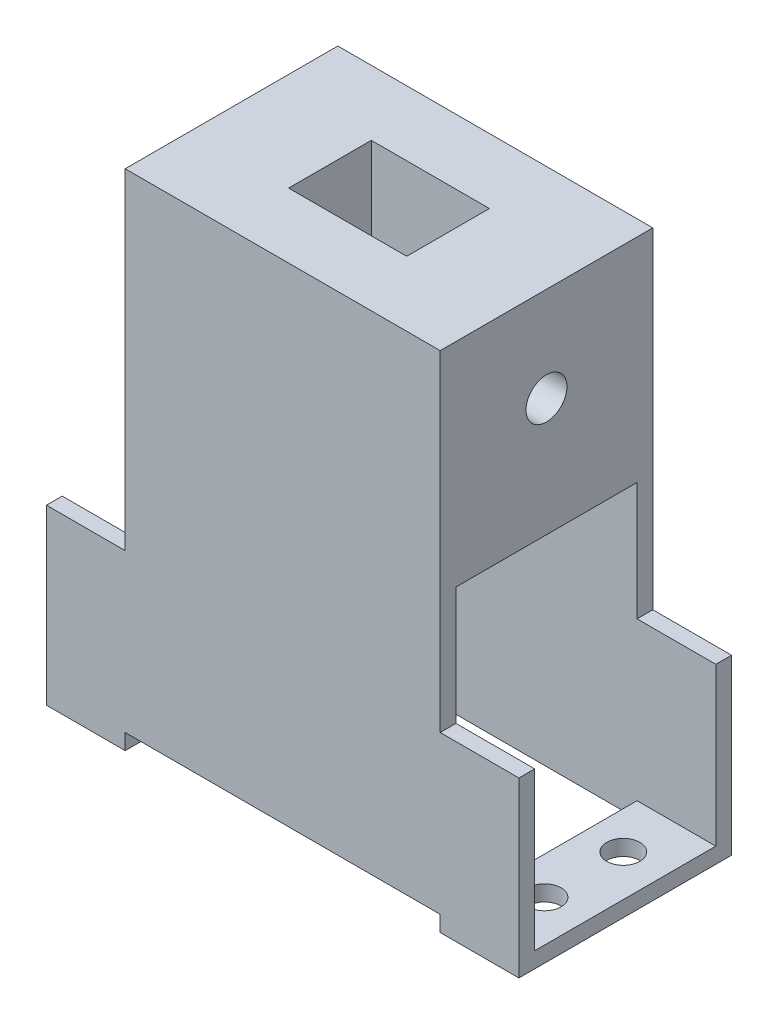
ISO-10303-21;
HEADER;
FILE_DESCRIPTION(('STEP AP214'),'2;1');
FILE_NAME('part.step','',(''),(''),'','','');
FILE_SCHEMA(('AUTOMOTIVE_DESIGN { 1 0 10303 214 1 1 1 1 }'));
ENDSEC;
DATA;
#1=APPLICATION_CONTEXT('core data for automotive mechanical design processes');
#2=APPLICATION_PROTOCOL_DEFINITION('international standard','automotive_design',2000,#1);
#3=PRODUCT_CONTEXT('',#1,'mechanical');
#4=PRODUCT('Part','Part','',(#3));
#5=PRODUCT_RELATED_PRODUCT_CATEGORY('part','',(#4));
#6=PRODUCT_DEFINITION_FORMATION('','',#4);
#7=PRODUCT_DEFINITION_CONTEXT('part definition',#1,'design');
#8=PRODUCT_DEFINITION('design','',#6,#7);
#9=PRODUCT_DEFINITION_SHAPE('','',#8);
#10=(LENGTH_UNIT() NAMED_UNIT(*) SI_UNIT(.MILLI.,.METRE.));
#11=(NAMED_UNIT(*) PLANE_ANGLE_UNIT() SI_UNIT($,.RADIAN.));
#12=(NAMED_UNIT(*) SI_UNIT($,.STERADIAN.) SOLID_ANGLE_UNIT());
#13=UNCERTAINTY_MEASURE_WITH_UNIT(LENGTH_MEASURE(1.E-05),#10,'distance_accuracy_value','');
#14=(GEOMETRIC_REPRESENTATION_CONTEXT(3) GLOBAL_UNCERTAINTY_ASSIGNED_CONTEXT((#13)) GLOBAL_UNIT_ASSIGNED_CONTEXT((#10,
#11,#12)) REPRESENTATION_CONTEXT('',''));
#15=CARTESIAN_POINT('',(0.,0.,0.));
#16=DIRECTION('',(0.,0.,1.));
#17=DIRECTION('',(1.,0.,0.));
#18=AXIS2_PLACEMENT_3D('',#15,#16,#17);
#19=CARTESIAN_POINT('',(30.001,32.5,-11.5));
#20=DIRECTION('',(-1.,0.,0.));
#21=DIRECTION('',(0.,0.,1.));
#22=AXIS2_PLACEMENT_3D('',#19,#20,#21);
#23=CYLINDRICAL_SURFACE('',#22,2.6);
#24=CARTESIAN_POINT('',(7.5,32.5,-11.5));
#25=DIRECTION('',(1.,0.,0.));
#26=DIRECTION('',(0.,0.,-1.));
#27=AXIS2_PLACEMENT_3D('',#24,#25,#26);
#28=CIRCLE('',#27,2.6);
#29=CARTESIAN_POINT('',(7.5,32.5,-14.1));
#30=VERTEX_POINT('',#29);
#31=EDGE_CURVE('E48',#30,#30,#28,.F.);
#32=ORIENTED_EDGE('',*,*,#31,.T.);
#33=EDGE_LOOP('',(#32));
#34=FACE_BOUND('',#33,.T.);
#35=CARTESIAN_POINT('',(20.,32.5,-11.5));
#36=DIRECTION('',(-1.,0.,0.));
#37=DIRECTION('',(0.,-1.,0.));
#38=AXIS2_PLACEMENT_3D('',#35,#36,#37);
#39=CIRCLE('',#38,2.6);
#40=CARTESIAN_POINT('',(20.,29.9,-11.5));
#41=VERTEX_POINT('',#40);
#42=EDGE_CURVE('E258',#41,#41,#39,.F.);
#43=ORIENTED_EDGE('',*,*,#42,.T.);
#44=EDGE_LOOP('',(#43));
#45=FACE_BOUND('',#44,.T.);
#46=ADVANCED_FACE('F44',(#34,#45),#23,.F.);
#47=CARTESIAN_POINT('',(0.,-17.5,2.));
#48=DIRECTION('',(0.,-1.,0.));
#49=DIRECTION('',(0.,0.,-1.));
#50=AXIS2_PLACEMENT_3D('',#47,#48,#49);
#51=PLANE('',#50);
#52=DIRECTION('',(-1.,0.,0.));
#53=VECTOR('',#52,1.);
#54=CARTESIAN_POINT('',(0.,-17.5,0.));
#55=LINE('',#54,#53);
#56=CARTESIAN_POINT('',(20.,-17.5,0.));
#57=VERTEX_POINT('',#56);
#58=CARTESIAN_POINT('',(-20.,-17.5,0.));
#59=VERTEX_POINT('',#58);
#60=EDGE_CURVE('E421',#57,#59,#55,.T.);
#61=ORIENTED_EDGE('',*,*,#60,.F.);
#62=DIRECTION('',(0.,0.,-1.));
#63=VECTOR('',#62,1.);
#64=CARTESIAN_POINT('',(20.,-17.5,2.));
#65=LINE('',#64,#63);
#66=CARTESIAN_POINT('',(20.,-17.5,2.));
#67=VERTEX_POINT('',#66);
#68=EDGE_CURVE('E70',#67,#57,#65,.T.);
#69=ORIENTED_EDGE('',*,*,#68,.F.);
#70=DIRECTION('',(-1.,0.,0.));
#71=VECTOR('',#70,1.);
#72=CARTESIAN_POINT('',(0.,-17.5,2.));
#73=LINE('',#72,#71);
#74=CARTESIAN_POINT('',(-20.,-17.5,2.));
#75=VERTEX_POINT('',#74);
#76=EDGE_CURVE('E399',#67,#75,#73,.T.);
#77=ORIENTED_EDGE('',*,*,#76,.T.);
#78=DIRECTION('',(0.,0.,1.));
#79=VECTOR('',#78,1.);
#80=CARTESIAN_POINT('',(-20.,-17.5,-23.));
#81=LINE('',#80,#79);
#82=EDGE_CURVE('E11',#59,#75,#81,.T.);
#83=ORIENTED_EDGE('',*,*,#82,.F.);
#84=EDGE_LOOP('',(#61,#69,#77,#83));
#85=FACE_BOUND('',#84,.T.);
#86=ADVANCED_FACE('F462',(#85),#51,.T.);
#87=CARTESIAN_POINT('',(0.,2.5,2.));
#88=DIRECTION('',(0.,1.,0.));
#89=DIRECTION('',(-1.,0.,0.));
#90=AXIS2_PLACEMENT_3D('',#87,#88,#89);
#91=PLANE('',#90);
#92=DIRECTION('',(1.,0.,0.));
#93=VECTOR('',#92,1.);
#94=CARTESIAN_POINT('',(0.,2.5,0.));
#95=LINE('',#94,#93);
#96=CARTESIAN_POINT('',(-30.,2.5,0.));
#97=VERTEX_POINT('',#96);
#98=CARTESIAN_POINT('',(-20.,2.5,0.));
#99=VERTEX_POINT('',#98);
#100=EDGE_CURVE('E391',#97,#99,#95,.T.);
#101=ORIENTED_EDGE('',*,*,#100,.F.);
#102=DIRECTION('',(0.,0.,-1.));
#103=VECTOR('',#102,1.);
#104=CARTESIAN_POINT('',(-30.,2.5,2.));
#105=LINE('',#104,#103);
#106=CARTESIAN_POINT('',(-30.,2.5,2.));
#107=VERTEX_POINT('',#106);
#108=EDGE_CURVE('E53',#107,#97,#105,.T.);
#109=ORIENTED_EDGE('',*,*,#108,.F.);
#110=DIRECTION('',(1.,0.,0.));
#111=VECTOR('',#110,1.);
#112=CARTESIAN_POINT('',(0.,2.5,2.));
#113=LINE('',#112,#111);
#114=CARTESIAN_POINT('',(-20.,2.5,2.));
#115=VERTEX_POINT('',#114);
#116=EDGE_CURVE('E392',#107,#115,#113,.T.);
#117=ORIENTED_EDGE('',*,*,#116,.T.);
#118=DIRECTION('',(0.,0.,-1.));
#119=VECTOR('',#118,1.);
#120=CARTESIAN_POINT('',(-20.,2.5,2.));
#121=LINE('',#120,#119);
#122=EDGE_CURVE('E410',#115,#99,#121,.T.);
#123=ORIENTED_EDGE('',*,*,#122,.T.);
#124=EDGE_LOOP('',(#101,#109,#117,#123));
#125=FACE_BOUND('',#124,.T.);
#126=ADVANCED_FACE('F46',(#125),#91,.T.);
#127=CARTESIAN_POINT('',(-30.,0.,2.));
#128=DIRECTION('',(-1.,0.,0.));
#129=DIRECTION('',(0.,0.,1.));
#130=AXIS2_PLACEMENT_3D('',#127,#128,#129);
#131=PLANE('',#130);
#132=DIRECTION('',(0.,1.,0.));
#133=VECTOR('',#132,1.);
#134=CARTESIAN_POINT('',(-30.,0.,0.));
#135=LINE('',#134,#133);
#136=CARTESIAN_POINT('',(-30.,-17.5,0.));
#137=VERTEX_POINT('',#136);
#138=EDGE_CURVE('E413',#137,#97,#135,.T.);
#139=ORIENTED_EDGE('',*,*,#138,.F.);
#140=DIRECTION('',(0.,0.,-1.));
#141=VECTOR('',#140,1.);
#142=CARTESIAN_POINT('',(-30.,-17.5,2.));
#143=LINE('',#142,#141);
#144=CARTESIAN_POINT('',(-30.,-17.5,-23.));
#145=VERTEX_POINT('',#144);
#146=EDGE_CURVE('E366',#137,#145,#143,.T.);
#147=ORIENTED_EDGE('',*,*,#146,.T.);
#148=DIRECTION('',(0.,1.,0.));
#149=VECTOR('',#148,1.);
#150=CARTESIAN_POINT('',(-30.,-19.5,-23.));
#151=LINE('',#150,#149);
#152=CARTESIAN_POINT('',(-30.,2.5,-23.));
#153=VERTEX_POINT('',#152);
#154=EDGE_CURVE('E308',#145,#153,#151,.T.);
#155=ORIENTED_EDGE('',*,*,#154,.T.);
#156=DIRECTION('',(0.,0.,1.));
#157=VECTOR('',#156,1.);
#158=CARTESIAN_POINT('',(-30.,2.5,-25.));
#159=LINE('',#158,#157);
#160=CARTESIAN_POINT('',(-30.,2.5,-25.));
#161=VERTEX_POINT('',#160);
#162=EDGE_CURVE('E349',#161,#153,#159,.T.);
#163=ORIENTED_EDGE('',*,*,#162,.F.);
#164=DIRECTION('',(0.,1.,0.));
#165=VECTOR('',#164,1.);
#166=CARTESIAN_POINT('',(-30.,-17.5,-25.));
#167=LINE('',#166,#165);
#168=CARTESIAN_POINT('',(-30.,-19.5,-25.));
#169=VERTEX_POINT('',#168);
#170=EDGE_CURVE('E304',#169,#161,#167,.T.);
#171=ORIENTED_EDGE('',*,*,#170,.F.);
#172=DIRECTION('',(0.,0.,-1.));
#173=VECTOR('',#172,1.);
#174=CARTESIAN_POINT('',(-30.,-19.5,2.));
#175=LINE('',#174,#173);
#176=CARTESIAN_POINT('',(-30.,-19.5,2.));
#177=VERTEX_POINT('',#176);
#178=EDGE_CURVE('E376',#177,#169,#175,.T.);
#179=ORIENTED_EDGE('',*,*,#178,.F.);
#180=DIRECTION('',(0.,1.,0.));
#181=VECTOR('',#180,1.);
#182=CARTESIAN_POINT('',(-30.,0.,2.));
#183=LINE('',#182,#181);
#184=EDGE_CURVE('E395',#177,#107,#183,.T.);
#185=ORIENTED_EDGE('',*,*,#184,.T.);
#186=ORIENTED_EDGE('',*,*,#108,.T.);
#187=EDGE_LOOP('',(#139,#147,#155,#163,#171,#179,#185,#186));
#188=FACE_BOUND('',#187,.T.);
#189=ADVANCED_FACE('F549',(#188),#131,.T.);
#190=CARTESIAN_POINT('',(30.,0.,2.));
#191=DIRECTION('',(1.,0.,0.));
#192=DIRECTION('',(0.,1.,0.));
#193=AXIS2_PLACEMENT_3D('',#190,#191,#192);
#194=PLANE('',#193);
#195=DIRECTION('',(0.,-1.,0.));
#196=VECTOR('',#195,1.);
#197=CARTESIAN_POINT('',(30.,0.,0.));
#198=LINE('',#197,#196);
#199=CARTESIAN_POINT('',(30.,2.50000000000001,0.));
#200=VERTEX_POINT('',#199);
#201=CARTESIAN_POINT('',(30.,-17.5,0.));
#202=VERTEX_POINT('',#201);
#203=EDGE_CURVE('E420',#200,#202,#198,.T.);
#204=ORIENTED_EDGE('',*,*,#203,.F.);
#205=DIRECTION('',(0.,0.,-1.));
#206=VECTOR('',#205,1.);
#207=CARTESIAN_POINT('',(30.,2.50000000000001,2.));
#208=LINE('',#207,#206);
#209=CARTESIAN_POINT('',(30.,2.50000000000001,2.));
#210=VERTEX_POINT('',#209);
#211=EDGE_CURVE('E438',#210,#200,#208,.T.);
#212=ORIENTED_EDGE('',*,*,#211,.F.);
#213=DIRECTION('',(0.,-1.,0.));
#214=VECTOR('',#213,1.);
#215=CARTESIAN_POINT('',(30.,0.,2.));
#216=LINE('',#215,#214);
#217=CARTESIAN_POINT('',(30.,-19.5,2.));
#218=VERTEX_POINT('',#217);
#219=EDGE_CURVE('E401',#210,#218,#216,.T.);
#220=ORIENTED_EDGE('',*,*,#219,.T.);
#221=DIRECTION('',(0.,0.,1.));
#222=VECTOR('',#221,1.);
#223=CARTESIAN_POINT('',(30.,-19.5,-23.));
#224=LINE('',#223,#222);
#225=CARTESIAN_POINT('',(30.,-19.5,-25.));
#226=VERTEX_POINT('',#225);
#227=EDGE_CURVE('E370',#226,#218,#224,.T.);
#228=ORIENTED_EDGE('',*,*,#227,.F.);
#229=DIRECTION('',(0.,-1.,0.));
#230=VECTOR('',#229,1.);
#231=CARTESIAN_POINT('',(30.,2.50000000000001,-25.));
#232=LINE('',#231,#230);
#233=CARTESIAN_POINT('',(30.,2.50000000000001,-25.));
#234=VERTEX_POINT('',#233);
#235=EDGE_CURVE('E316',#234,#226,#232,.T.);
#236=ORIENTED_EDGE('',*,*,#235,.F.);
#237=DIRECTION('',(0.,0.,1.));
#238=VECTOR('',#237,1.);
#239=CARTESIAN_POINT('',(30.,2.50000000000001,-25.));
#240=LINE('',#239,#238);
#241=CARTESIAN_POINT('',(30.,2.50000000000001,-23.));
#242=VERTEX_POINT('',#241);
#243=EDGE_CURVE('E322',#234,#242,#240,.T.);
#244=ORIENTED_EDGE('',*,*,#243,.T.);
#245=DIRECTION('',(0.,-1.,0.));
#246=VECTOR('',#245,1.);
#247=CARTESIAN_POINT('',(30.,-19.5,-23.));
#248=LINE('',#247,#246);
#249=CARTESIAN_POINT('',(30.,-17.5,-23.));
#250=VERTEX_POINT('',#249);
#251=EDGE_CURVE('E334',#242,#250,#248,.T.);
#252=ORIENTED_EDGE('',*,*,#251,.T.);
#253=DIRECTION('',(0.,0.,1.));
#254=VECTOR('',#253,1.);
#255=CARTESIAN_POINT('',(30.,-17.5,-23.));
#256=LINE('',#255,#254);
#257=EDGE_CURVE('E359',#250,#202,#256,.T.);
#258=ORIENTED_EDGE('',*,*,#257,.T.);
#259=EDGE_LOOP('',(#204,#212,#220,#228,#236,#244,#252,#258));
#260=FACE_BOUND('',#259,.T.);
#261=ADVANCED_FACE('F546',(#260),#194,.T.);
#262=CARTESIAN_POINT('',(0.,2.5,2.));
#263=DIRECTION('',(0.,1.,0.));
#264=DIRECTION('',(-1.,0.,0.));
#265=AXIS2_PLACEMENT_3D('',#262,#263,#264);
#266=PLANE('',#265);
#267=DIRECTION('',(1.,0.,0.));
#268=VECTOR('',#267,1.);
#269=CARTESIAN_POINT('',(0.,2.5,0.));
#270=LINE('',#269,#268);
#271=CARTESIAN_POINT('',(20.,2.5,0.));
#272=VERTEX_POINT('',#271);
#273=EDGE_CURVE('E424',#272,#200,#270,.T.);
#274=ORIENTED_EDGE('',*,*,#273,.F.);
#275=DIRECTION('',(0.,0.,-1.));
#276=VECTOR('',#275,1.);
#277=CARTESIAN_POINT('',(20.,2.5,2.));
#278=LINE('',#277,#276);
#279=CARTESIAN_POINT('',(20.,2.5,2.));
#280=VERTEX_POINT('',#279);
#281=EDGE_CURVE('E436',#280,#272,#278,.T.);
#282=ORIENTED_EDGE('',*,*,#281,.F.);
#283=DIRECTION('',(1.,0.,0.));
#284=VECTOR('',#283,1.);
#285=CARTESIAN_POINT('',(0.,2.5,2.));
#286=LINE('',#285,#284);
#287=EDGE_CURVE('E403',#280,#210,#286,.T.);
#288=ORIENTED_EDGE('',*,*,#287,.T.);
#289=ORIENTED_EDGE('',*,*,#211,.T.);
#290=EDGE_LOOP('',(#274,#282,#288,#289));
#291=FACE_BOUND('',#290,.T.);
#292=ADVANCED_FACE('F542',(#291),#266,.T.);
#293=CARTESIAN_POINT('',(20.,0.,2.));
#294=DIRECTION('',(-1.,0.,0.));
#295=DIRECTION('',(0.,-1.,0.));
#296=AXIS2_PLACEMENT_3D('',#293,#294,#295);
#297=PLANE('',#296);
#298=ORIENTED_EDGE('',*,*,#42,.F.);
#299=EDGE_LOOP('',(#298));
#300=FACE_BOUND('',#299,.T.);
#301=DIRECTION('',(0.,1.,0.));
#302=VECTOR('',#301,1.);
#303=CARTESIAN_POINT('',(20.,0.,0.));
#304=LINE('',#303,#302);
#305=CARTESIAN_POINT('',(20.,17.5,0.));
#306=VERTEX_POINT('',#305);
#307=EDGE_CURVE('E427',#272,#306,#304,.T.);
#308=ORIENTED_EDGE('',*,*,#307,.T.);
#309=DIRECTION('',(0.,0.,-1.));
#310=VECTOR('',#309,1.);
#311=CARTESIAN_POINT('',(20.,17.5,2.));
#312=LINE('',#311,#310);
#313=CARTESIAN_POINT('',(20.,17.5,-23.));
#314=VERTEX_POINT('',#313);
#315=EDGE_CURVE('E276',#306,#314,#312,.T.);
#316=ORIENTED_EDGE('',*,*,#315,.T.);
#317=DIRECTION('',(0.,-1.,0.));
#318=VECTOR('',#317,1.);
#319=CARTESIAN_POINT('',(20.,17.5,-23.));
#320=LINE('',#319,#318);
#321=CARTESIAN_POINT('',(20.,2.5,-23.));
#322=VERTEX_POINT('',#321);
#323=EDGE_CURVE('E329',#314,#322,#320,.T.);
#324=ORIENTED_EDGE('',*,*,#323,.T.);
#325=DIRECTION('',(0.,0.,1.));
#326=VECTOR('',#325,1.);
#327=CARTESIAN_POINT('',(20.,2.5,-25.));
#328=LINE('',#327,#326);
#329=CARTESIAN_POINT('',(20.,2.5,-25.));
#330=VERTEX_POINT('',#329);
#331=EDGE_CURVE('E343',#330,#322,#328,.T.);
#332=ORIENTED_EDGE('',*,*,#331,.F.);
#333=DIRECTION('',(0.,-1.,0.));
#334=VECTOR('',#333,1.);
#335=CARTESIAN_POINT('',(20.,17.5,-25.));
#336=LINE('',#335,#334);
#337=CARTESIAN_POINT('',(20.,44.5,-25.));
#338=VERTEX_POINT('',#337);
#339=EDGE_CURVE('E312',#338,#330,#336,.T.);
#340=ORIENTED_EDGE('',*,*,#339,.F.);
#341=DIRECTION('',(0.,0.,-1.));
#342=VECTOR('',#341,1.);
#343=CARTESIAN_POINT('',(20.,44.5,2.));
#344=LINE('',#343,#342);
#345=CARTESIAN_POINT('',(20.,44.5,2.));
#346=VERTEX_POINT('',#345);
#347=EDGE_CURVE('E264',#346,#338,#344,.T.);
#348=ORIENTED_EDGE('',*,*,#347,.F.);
#349=DIRECTION('',(0.,1.,0.));
#350=VECTOR('',#349,1.);
#351=CARTESIAN_POINT('',(20.,0.,2.));
#352=LINE('',#351,#350);
#353=EDGE_CURVE('E406',#280,#346,#352,.T.);
#354=ORIENTED_EDGE('',*,*,#353,.F.);
#355=ORIENTED_EDGE('',*,*,#281,.T.);
#356=EDGE_LOOP('',(#308,#316,#324,#332,#340,#348,#354,#355));
#357=FACE_BOUND('',#356,.T.);
#358=ADVANCED_FACE('F538',(#300,#357),#297,.F.);
#359=CARTESIAN_POINT('',(-20.,0.,2.));
#360=DIRECTION('',(-1.,0.,0.));
#361=DIRECTION('',(0.,0.,1.));
#362=AXIS2_PLACEMENT_3D('',#359,#360,#361);
#363=PLANE('',#362);
#364=CARTESIAN_POINT('',(-20.,32.5,-11.5));
#365=DIRECTION('',(-1.,0.,0.));
#366=DIRECTION('',(0.,0.,1.));
#367=AXIS2_PLACEMENT_3D('',#364,#365,#366);
#368=CIRCLE('',#367,2.6);
#369=CARTESIAN_POINT('',(-20.,32.5,-8.90000000000001));
#370=VERTEX_POINT('',#369);
#371=EDGE_CURVE('E255',#370,#370,#368,.T.);
#372=ORIENTED_EDGE('',*,*,#371,.F.);
#373=EDGE_LOOP('',(#372));
#374=FACE_BOUND('',#373,.T.);
#375=DIRECTION('',(0.,1.,0.));
#376=VECTOR('',#375,1.);
#377=CARTESIAN_POINT('',(-20.,0.,0.));
#378=LINE('',#377,#376);
#379=CARTESIAN_POINT('',(-20.,17.5,0.));
#380=VERTEX_POINT('',#379);
#381=EDGE_CURVE('E396',#99,#380,#378,.T.);
#382=ORIENTED_EDGE('',*,*,#381,.F.);
#383=ORIENTED_EDGE('',*,*,#122,.F.);
#384=DIRECTION('',(0.,1.,0.));
#385=VECTOR('',#384,1.);
#386=CARTESIAN_POINT('',(-20.,0.,2.));
#387=LINE('',#386,#385);
#388=CARTESIAN_POINT('',(-20.,44.5,2.));
#389=VERTEX_POINT('',#388);
#390=EDGE_CURVE('E408',#115,#389,#387,.T.);
#391=ORIENTED_EDGE('',*,*,#390,.T.);
#392=DIRECTION('',(0.,0.,1.));
#393=VECTOR('',#392,1.);
#394=CARTESIAN_POINT('',(-20.,44.5,-25.));
#395=LINE('',#394,#393);
#396=CARTESIAN_POINT('',(-20.,44.5,-25.));
#397=VERTEX_POINT('',#396);
#398=EDGE_CURVE('E270',#397,#389,#395,.T.);
#399=ORIENTED_EDGE('',*,*,#398,.F.);
#400=DIRECTION('',(0.,1.,0.));
#401=VECTOR('',#400,1.);
#402=CARTESIAN_POINT('',(-20.,2.5,-25.));
#403=LINE('',#402,#401);
#404=CARTESIAN_POINT('',(-20.,2.5,-25.));
#405=VERTEX_POINT('',#404);
#406=EDGE_CURVE('E310',#405,#397,#403,.T.);
#407=ORIENTED_EDGE('',*,*,#406,.F.);
#408=DIRECTION('',(0.,0.,1.));
#409=VECTOR('',#408,1.);
#410=CARTESIAN_POINT('',(-20.,2.5,-25.));
#411=LINE('',#410,#409);
#412=CARTESIAN_POINT('',(-20.,2.5,-23.));
#413=VERTEX_POINT('',#412);
#414=EDGE_CURVE('E346',#405,#413,#411,.T.);
#415=ORIENTED_EDGE('',*,*,#414,.T.);
#416=DIRECTION('',(0.,1.,0.));
#417=VECTOR('',#416,1.);
#418=CARTESIAN_POINT('',(-20.,2.5,-23.));
#419=LINE('',#418,#417);
#420=CARTESIAN_POINT('',(-20.,17.5,-23.));
#421=VERTEX_POINT('',#420);
#422=EDGE_CURVE('E324',#413,#421,#419,.T.);
#423=ORIENTED_EDGE('',*,*,#422,.T.);
#424=DIRECTION('',(0.,0.,1.));
#425=VECTOR('',#424,1.);
#426=CARTESIAN_POINT('',(-20.,17.5,0.));
#427=LINE('',#426,#425);
#428=EDGE_CURVE('E273',#421,#380,#427,.T.);
#429=ORIENTED_EDGE('',*,*,#428,.T.);
#430=EDGE_LOOP('',(#382,#383,#391,#399,#407,#415,#423,#429));
#431=FACE_BOUND('',#430,.T.);
#432=ADVANCED_FACE('F531',(#374,#431),#363,.T.);
#433=CARTESIAN_POINT('',(0.,0.,2.));
#434=DIRECTION('',(0.,0.,1.));
#435=DIRECTION('',(1.,0.,0.));
#436=AXIS2_PLACEMENT_3D('',#433,#434,#435);
#437=PLANE('',#436);
#438=ORIENTED_EDGE('',*,*,#116,.F.);
#439=ORIENTED_EDGE('',*,*,#184,.F.);
#440=DIRECTION('',(-1.,0.,0.));
#441=VECTOR('',#440,1.);
#442=CARTESIAN_POINT('',(-20.,-19.5,2.));
#443=LINE('',#442,#441);
#444=CARTESIAN_POINT('',(-20.,-19.5,2.));
#445=VERTEX_POINT('',#444);
#446=EDGE_CURVE('E373',#445,#177,#443,.T.);
#447=ORIENTED_EDGE('',*,*,#446,.F.);
#448=DIRECTION('',(0.,1.,0.));
#449=VECTOR('',#448,1.);
#450=CARTESIAN_POINT('',(-20.,-19.5,2.));
#451=LINE('',#450,#449);
#452=EDGE_CURVE('E380',#445,#75,#451,.T.);
#453=ORIENTED_EDGE('',*,*,#452,.T.);
#454=ORIENTED_EDGE('',*,*,#76,.F.);
#455=DIRECTION('',(0.,1.,0.));
#456=VECTOR('',#455,1.);
#457=CARTESIAN_POINT('',(20.,-19.5,2.));
#458=LINE('',#457,#456);
#459=CARTESIAN_POINT('',(20.,-19.5,2.));
#460=VERTEX_POINT('',#459);
#461=EDGE_CURVE('E352',#460,#67,#458,.T.);
#462=ORIENTED_EDGE('',*,*,#461,.F.);
#463=DIRECTION('',(-1.,0.,0.));
#464=VECTOR('',#463,1.);
#465=CARTESIAN_POINT('',(30.,-19.5,2.));
#466=LINE('',#465,#464);
#467=EDGE_CURVE('E368',#218,#460,#466,.T.);
#468=ORIENTED_EDGE('',*,*,#467,.F.);
#469=ORIENTED_EDGE('',*,*,#219,.F.);
#470=ORIENTED_EDGE('',*,*,#287,.F.);
#471=ORIENTED_EDGE('',*,*,#353,.T.);
#472=DIRECTION('',(1.,0.,0.));
#473=VECTOR('',#472,1.);
#474=CARTESIAN_POINT('',(-20.,44.5,2.));
#475=LINE('',#474,#473);
#476=EDGE_CURVE('E261',#389,#346,#475,.T.);
#477=ORIENTED_EDGE('',*,*,#476,.F.);
#478=ORIENTED_EDGE('',*,*,#390,.F.);
#479=EDGE_LOOP('',(#438,#439,#447,#453,#454,#462,#468,#469,#470,#471,#477,#478));
#480=FACE_BOUND('',#479,.T.);
#481=ADVANCED_FACE('F528',(#480),#437,.T.);
#482=CARTESIAN_POINT('',(0.,0.,0.));
#483=DIRECTION('',(0.,0.,1.));
#484=DIRECTION('',(1.,0.,0.));
#485=AXIS2_PLACEMENT_3D('',#482,#483,#484);
#486=PLANE('',#485);
#487=ORIENTED_EDGE('',*,*,#100,.T.);
#488=ORIENTED_EDGE('',*,*,#381,.T.);
#489=DIRECTION('',(1.,0.,0.));
#490=VECTOR('',#489,1.);
#491=CARTESIAN_POINT('',(0.,17.5,0.));
#492=LINE('',#491,#490);
#493=EDGE_CURVE('E430',#380,#306,#492,.T.);
#494=ORIENTED_EDGE('',*,*,#493,.T.);
#495=ORIENTED_EDGE('',*,*,#307,.F.);
#496=ORIENTED_EDGE('',*,*,#273,.T.);
#497=ORIENTED_EDGE('',*,*,#203,.T.);
#498=EDGE_CURVE('E417',#202,#57,#55,.T.);
#499=ORIENTED_EDGE('',*,*,#498,.T.);
#500=ORIENTED_EDGE('',*,*,#60,.T.);
#501=EDGE_CURVE('E416',#59,#137,#55,.T.);
#502=ORIENTED_EDGE('',*,*,#501,.T.);
#503=ORIENTED_EDGE('',*,*,#138,.T.);
#504=EDGE_LOOP('',(#487,#488,#494,#495,#496,#497,#499,#500,#502,#503));
#505=FACE_BOUND('',#504,.T.);
#506=ADVANCED_FACE('F526',(#505),#486,.F.);
#507=CARTESIAN_POINT('',(-20.,-19.5,-23.));
#508=DIRECTION('',(-1.,0.,0.));
#509=DIRECTION('',(0.,-1.,0.));
#510=AXIS2_PLACEMENT_3D('',#507,#508,#509);
#511=PLANE('',#510);
#512=CARTESIAN_POINT('',(-20.,-17.5,-23.));
#513=VERTEX_POINT('',#512);
#514=EDGE_CURVE('E55',#513,#59,#81,.T.);
#515=ORIENTED_EDGE('',*,*,#514,.T.);
#516=ORIENTED_EDGE('',*,*,#82,.T.);
#517=ORIENTED_EDGE('',*,*,#452,.F.);
#518=DIRECTION('',(0.,0.,1.));
#519=VECTOR('',#518,1.);
#520=CARTESIAN_POINT('',(-20.,-19.5,-23.));
#521=LINE('',#520,#519);
#522=CARTESIAN_POINT('',(-20.,-19.5,-23.));
#523=VERTEX_POINT('',#522);
#524=EDGE_CURVE('E378',#523,#445,#521,.T.);
#525=ORIENTED_EDGE('',*,*,#524,.F.);
#526=DIRECTION('',(0.,1.,0.));
#527=VECTOR('',#526,1.);
#528=CARTESIAN_POINT('',(-20.,-19.5,-23.));
#529=LINE('',#528,#527);
#530=EDGE_CURVE('E388',#523,#513,#529,.T.);
#531=ORIENTED_EDGE('',*,*,#530,.T.);
#532=EDGE_LOOP('',(#515,#516,#517,#525,#531));
#533=FACE_BOUND('',#532,.T.);
#534=ADVANCED_FACE('F519',(#533),#511,.F.);
#535=CARTESIAN_POINT('',(0.,-19.5,0.));
#536=DIRECTION('',(0.,-1.,0.));
#537=DIRECTION('',(1.,0.,0.));
#538=AXIS2_PLACEMENT_3D('',#535,#536,#537);
#539=PLANE('',#538);
#540=CARTESIAN_POINT('',(24.75,-19.5,-6.5));
#541=DIRECTION('',(0.,-1.,0.));
#542=DIRECTION('',(1.,0.,0.));
#543=AXIS2_PLACEMENT_3D('',#540,#541,#542);
#544=CIRCLE('',#543,2.1);
#545=CARTESIAN_POINT('',(26.85,-19.5,-6.5));
#546=VERTEX_POINT('',#545);
#547=EDGE_CURVE('E286',#546,#546,#544,.F.);
#548=ORIENTED_EDGE('',*,*,#547,.T.);
#549=EDGE_LOOP('',(#548));
#550=FACE_BOUND('',#549,.T.);
#551=CARTESIAN_POINT('',(-24.75,-19.5,-16.5));
#552=DIRECTION('',(0.,-1.,0.));
#553=DIRECTION('',(1.,0.,0.));
#554=AXIS2_PLACEMENT_3D('',#551,#552,#553);
#555=CIRCLE('',#554,2.1);
#556=CARTESIAN_POINT('',(-22.65,-19.5,-16.5));
#557=VERTEX_POINT('',#556);
#558=EDGE_CURVE('E293',#557,#557,#555,.F.);
#559=ORIENTED_EDGE('',*,*,#558,.T.);
#560=EDGE_LOOP('',(#559));
#561=FACE_BOUND('',#560,.T.);
#562=CARTESIAN_POINT('',(-24.75,-19.5,-6.49999999999999));
#563=DIRECTION('',(0.,-1.,0.));
#564=DIRECTION('',(1.,0.,0.));
#565=AXIS2_PLACEMENT_3D('',#562,#563,#564);
#566=CIRCLE('',#565,2.1);
#567=CARTESIAN_POINT('',(-22.65,-19.5,-6.49999999999999));
#568=VERTEX_POINT('',#567);
#569=EDGE_CURVE('E280',#568,#568,#566,.F.);
#570=ORIENTED_EDGE('',*,*,#569,.T.);
#571=EDGE_LOOP('',(#570));
#572=FACE_BOUND('',#571,.T.);
#573=CARTESIAN_POINT('',(24.75,-19.5,-16.5));
#574=DIRECTION('',(0.,-1.,0.));
#575=DIRECTION('',(1.,0.,0.));
#576=AXIS2_PLACEMENT_3D('',#573,#574,#575);
#577=CIRCLE('',#576,2.1);
#578=CARTESIAN_POINT('',(26.85,-19.5,-16.5));
#579=VERTEX_POINT('',#578);
#580=EDGE_CURVE('E289',#579,#579,#577,.F.);
#581=ORIENTED_EDGE('',*,*,#580,.T.);
#582=EDGE_LOOP('',(#581));
#583=FACE_BOUND('',#582,.T.);
#584=ORIENTED_EDGE('',*,*,#446,.T.);
#585=ORIENTED_EDGE('',*,*,#178,.T.);
#586=DIRECTION('',(-1.,0.,0.));
#587=VECTOR('',#586,1.);
#588=CARTESIAN_POINT('',(30.,-19.5,-25.));
#589=LINE('',#588,#587);
#590=EDGE_CURVE('E319',#226,#169,#589,.T.);
#591=ORIENTED_EDGE('',*,*,#590,.F.);
#592=ORIENTED_EDGE('',*,*,#227,.T.);
#593=ORIENTED_EDGE('',*,*,#467,.T.);
#594=DIRECTION('',(0.,0.,-1.));
#595=VECTOR('',#594,1.);
#596=CARTESIAN_POINT('',(20.,-19.5,2.));
#597=LINE('',#596,#595);
#598=CARTESIAN_POINT('',(20.,-19.5,-23.));
#599=VERTEX_POINT('',#598);
#600=EDGE_CURVE('E357',#460,#599,#597,.T.);
#601=ORIENTED_EDGE('',*,*,#600,.T.);
#602=DIRECTION('',(-1.,0.,0.));
#603=VECTOR('',#602,1.);
#604=CARTESIAN_POINT('',(30.,-19.5,-23.));
#605=LINE('',#604,#603);
#606=EDGE_CURVE('E337',#599,#523,#605,.T.);
#607=ORIENTED_EDGE('',*,*,#606,.T.);
#608=ORIENTED_EDGE('',*,*,#524,.T.);
#609=EDGE_LOOP('',(#584,#585,#591,#592,#593,#601,#607,#608));
#610=FACE_BOUND('',#609,.T.);
#611=ADVANCED_FACE('F516',(#550,#561,#572,#583,#610),#539,.T.);
#612=CARTESIAN_POINT('',(0.,-17.5,0.));
#613=DIRECTION('',(0.,-1.,0.));
#614=DIRECTION('',(1.,0.,0.));
#615=AXIS2_PLACEMENT_3D('',#612,#613,#614);
#616=PLANE('',#615);
#617=CARTESIAN_POINT('',(-24.75,-17.5,-16.5));
#618=DIRECTION('',(0.,1.,0.));
#619=DIRECTION('',(-1.,0.,0.));
#620=AXIS2_PLACEMENT_3D('',#617,#618,#619);
#621=CIRCLE('',#620,2.1);
#622=CARTESIAN_POINT('',(-26.85,-17.5,-16.5));
#623=VERTEX_POINT('',#622);
#624=EDGE_CURVE('E283',#623,#623,#621,.T.);
#625=ORIENTED_EDGE('',*,*,#624,.F.);
#626=EDGE_LOOP('',(#625));
#627=FACE_BOUND('',#626,.T.);
#628=CARTESIAN_POINT('',(-24.75,-17.5,-6.49999999999999));
#629=DIRECTION('',(0.,1.,0.));
#630=DIRECTION('',(-1.,0.,0.));
#631=AXIS2_PLACEMENT_3D('',#628,#629,#630);
#632=CIRCLE('',#631,2.1);
#633=CARTESIAN_POINT('',(-26.85,-17.5,-6.49999999999999));
#634=VERTEX_POINT('',#633);
#635=EDGE_CURVE('E279',#634,#634,#632,.T.);
#636=ORIENTED_EDGE('',*,*,#635,.F.);
#637=EDGE_LOOP('',(#636));
#638=FACE_BOUND('',#637,.T.);
#639=ORIENTED_EDGE('',*,*,#501,.F.);
#640=ORIENTED_EDGE('',*,*,#514,.F.);
#641=DIRECTION('',(1.,0.,0.));
#642=VECTOR('',#641,1.);
#643=CARTESIAN_POINT('',(-30.,-17.5,-23.));
#644=LINE('',#643,#642);
#645=EDGE_CURVE('E383',#145,#513,#644,.T.);
#646=ORIENTED_EDGE('',*,*,#645,.F.);
#647=ORIENTED_EDGE('',*,*,#146,.F.);
#648=EDGE_LOOP('',(#639,#640,#646,#647));
#649=FACE_BOUND('',#648,.T.);
#650=ADVANCED_FACE('F514',(#627,#638,#649),#616,.F.);
#651=CARTESIAN_POINT('',(0.,-17.5,0.));
#652=DIRECTION('',(0.,-1.,0.));
#653=DIRECTION('',(1.,0.,0.));
#654=AXIS2_PLACEMENT_3D('',#651,#652,#653);
#655=PLANE('',#654);
#656=CARTESIAN_POINT('',(24.75,-17.5,-6.5));
#657=DIRECTION('',(0.,1.,0.));
#658=DIRECTION('',(-1.,0.,0.));
#659=AXIS2_PLACEMENT_3D('',#656,#657,#658);
#660=CIRCLE('',#659,2.1);
#661=CARTESIAN_POINT('',(22.65,-17.5,-6.5));
#662=VERTEX_POINT('',#661);
#663=EDGE_CURVE('E290',#662,#662,#660,.T.);
#664=ORIENTED_EDGE('',*,*,#663,.F.);
#665=EDGE_LOOP('',(#664));
#666=FACE_BOUND('',#665,.T.);
#667=CARTESIAN_POINT('',(24.75,-17.5,-16.5));
#668=DIRECTION('',(0.,1.,0.));
#669=DIRECTION('',(-1.,0.,0.));
#670=AXIS2_PLACEMENT_3D('',#667,#668,#669);
#671=CIRCLE('',#670,2.1);
#672=CARTESIAN_POINT('',(22.65,-17.5,-16.5));
#673=VERTEX_POINT('',#672);
#674=EDGE_CURVE('E298',#673,#673,#671,.T.);
#675=ORIENTED_EDGE('',*,*,#674,.F.);
#676=EDGE_LOOP('',(#675));
#677=FACE_BOUND('',#676,.T.);
#678=CARTESIAN_POINT('',(20.,-17.5,-23.));
#679=VERTEX_POINT('',#678);
#680=EDGE_CURVE('E360',#57,#679,#65,.T.);
#681=ORIENTED_EDGE('',*,*,#680,.F.);
#682=ORIENTED_EDGE('',*,*,#498,.F.);
#683=ORIENTED_EDGE('',*,*,#257,.F.);
#684=DIRECTION('',(1.,0.,0.));
#685=VECTOR('',#684,1.);
#686=CARTESIAN_POINT('',(20.,-17.5,-23.));
#687=LINE('',#686,#685);
#688=EDGE_CURVE('E363',#679,#250,#687,.T.);
#689=ORIENTED_EDGE('',*,*,#688,.F.);
#690=EDGE_LOOP('',(#681,#682,#683,#689));
#691=FACE_BOUND('',#690,.T.);
#692=ADVANCED_FACE('F511',(#666,#677,#691),#655,.F.);
#693=CARTESIAN_POINT('',(20.,-19.5,2.));
#694=DIRECTION('',(1.,0.,0.));
#695=DIRECTION('',(0.,1.,0.));
#696=AXIS2_PLACEMENT_3D('',#693,#694,#695);
#697=PLANE('',#696);
#698=ORIENTED_EDGE('',*,*,#68,.T.);
#699=ORIENTED_EDGE('',*,*,#680,.T.);
#700=DIRECTION('',(0.,1.,0.));
#701=VECTOR('',#700,1.);
#702=CARTESIAN_POINT('',(20.,-19.5,-23.));
#703=LINE('',#702,#701);
#704=EDGE_CURVE('E354',#599,#679,#703,.T.);
#705=ORIENTED_EDGE('',*,*,#704,.F.);
#706=ORIENTED_EDGE('',*,*,#600,.F.);
#707=ORIENTED_EDGE('',*,*,#461,.T.);
#708=EDGE_LOOP('',(#698,#699,#705,#706,#707));
#709=FACE_BOUND('',#708,.T.);
#710=ADVANCED_FACE('F501',(#709),#697,.F.);
#711=CARTESIAN_POINT('',(0.,0.,-23.));
#712=DIRECTION('',(0.,0.,-1.));
#713=DIRECTION('',(-1.,0.,0.));
#714=AXIS2_PLACEMENT_3D('',#711,#712,#713);
#715=PLANE('',#714);
#716=ORIENTED_EDGE('',*,*,#154,.F.);
#717=ORIENTED_EDGE('',*,*,#645,.T.);
#718=ORIENTED_EDGE('',*,*,#530,.F.);
#719=ORIENTED_EDGE('',*,*,#606,.F.);
#720=ORIENTED_EDGE('',*,*,#704,.T.);
#721=ORIENTED_EDGE('',*,*,#688,.T.);
#722=ORIENTED_EDGE('',*,*,#251,.F.);
#723=DIRECTION('',(1.,0.,0.));
#724=VECTOR('',#723,1.);
#725=CARTESIAN_POINT('',(20.,2.5,-23.));
#726=LINE('',#725,#724);
#727=EDGE_CURVE('E331',#322,#242,#726,.T.);
#728=ORIENTED_EDGE('',*,*,#727,.F.);
#729=ORIENTED_EDGE('',*,*,#323,.F.);
#730=DIRECTION('',(1.,0.,0.));
#731=VECTOR('',#730,1.);
#732=CARTESIAN_POINT('',(-20.,17.5,-23.));
#733=LINE('',#732,#731);
#734=EDGE_CURVE('E326',#421,#314,#733,.T.);
#735=ORIENTED_EDGE('',*,*,#734,.F.);
#736=ORIENTED_EDGE('',*,*,#422,.F.);
#737=DIRECTION('',(1.,0.,0.));
#738=VECTOR('',#737,1.);
#739=CARTESIAN_POINT('',(-30.,2.5,-23.));
#740=LINE('',#739,#738);
#741=EDGE_CURVE('E301',#153,#413,#740,.T.);
#742=ORIENTED_EDGE('',*,*,#741,.F.);
#743=EDGE_LOOP('',(#716,#717,#718,#719,#720,#721,#722,#728,#729,#735,#736,#742));
#744=FACE_BOUND('',#743,.T.);
#745=ADVANCED_FACE('F497',(#744),#715,.F.);
#746=CARTESIAN_POINT('',(-30.,2.5,-25.));
#747=DIRECTION('',(0.,-1.,0.));
#748=DIRECTION('',(0.,0.,-1.));
#749=AXIS2_PLACEMENT_3D('',#746,#747,#748);
#750=PLANE('',#749);
#751=ORIENTED_EDGE('',*,*,#741,.T.);
#752=ORIENTED_EDGE('',*,*,#414,.F.);
#753=DIRECTION('',(1.,0.,0.));
#754=VECTOR('',#753,1.);
#755=CARTESIAN_POINT('',(-30.,2.5,-25.));
#756=LINE('',#755,#754);
#757=EDGE_CURVE('E307',#161,#405,#756,.T.);
#758=ORIENTED_EDGE('',*,*,#757,.F.);
#759=ORIENTED_EDGE('',*,*,#162,.T.);
#760=EDGE_LOOP('',(#751,#752,#758,#759));
#761=FACE_BOUND('',#760,.T.);
#762=ADVANCED_FACE('F500',(#761),#750,.F.);
#763=CARTESIAN_POINT('',(20.,2.5,-25.));
#764=DIRECTION('',(0.,-1.,0.));
#765=DIRECTION('',(1.,0.,0.));
#766=AXIS2_PLACEMENT_3D('',#763,#764,#765);
#767=PLANE('',#766);
#768=ORIENTED_EDGE('',*,*,#727,.T.);
#769=ORIENTED_EDGE('',*,*,#243,.F.);
#770=DIRECTION('',(1.,0.,0.));
#771=VECTOR('',#770,1.);
#772=CARTESIAN_POINT('',(20.,2.5,-25.));
#773=LINE('',#772,#771);
#774=EDGE_CURVE('E314',#330,#234,#773,.T.);
#775=ORIENTED_EDGE('',*,*,#774,.F.);
#776=ORIENTED_EDGE('',*,*,#331,.T.);
#777=EDGE_LOOP('',(#768,#769,#775,#776));
#778=FACE_BOUND('',#777,.T.);
#779=ADVANCED_FACE('F495',(#778),#767,.F.);
#780=CARTESIAN_POINT('',(0.,0.,-25.));
#781=DIRECTION('',(0.,0.,-1.));
#782=DIRECTION('',(-1.,0.,0.));
#783=AXIS2_PLACEMENT_3D('',#780,#781,#782);
#784=PLANE('',#783);
#785=ORIENTED_EDGE('',*,*,#170,.T.);
#786=ORIENTED_EDGE('',*,*,#757,.T.);
#787=ORIENTED_EDGE('',*,*,#406,.T.);
#788=DIRECTION('',(-1.,0.,0.));
#789=VECTOR('',#788,1.);
#790=CARTESIAN_POINT('',(20.,44.5,-25.));
#791=LINE('',#790,#789);
#792=EDGE_CURVE('E267',#338,#397,#791,.T.);
#793=ORIENTED_EDGE('',*,*,#792,.F.);
#794=ORIENTED_EDGE('',*,*,#339,.T.);
#795=ORIENTED_EDGE('',*,*,#774,.T.);
#796=ORIENTED_EDGE('',*,*,#235,.T.);
#797=ORIENTED_EDGE('',*,*,#590,.T.);
#798=EDGE_LOOP('',(#785,#786,#787,#793,#794,#795,#796,#797));
#799=FACE_BOUND('',#798,.T.);
#800=ADVANCED_FACE('F491',(#799),#784,.T.);
#801=CARTESIAN_POINT('',(24.75,-19.501,-16.5));
#802=DIRECTION('',(0.,1.,0.));
#803=DIRECTION('',(-1.,0.,0.));
#804=AXIS2_PLACEMENT_3D('',#801,#802,#803);
#805=CYLINDRICAL_SURFACE('',#804,2.1);
#806=ORIENTED_EDGE('',*,*,#580,.F.);
#807=EDGE_LOOP('',(#806));
#808=FACE_BOUND('',#807,.T.);
#809=ORIENTED_EDGE('',*,*,#674,.T.);
#810=EDGE_LOOP('',(#809));
#811=FACE_BOUND('',#810,.T.);
#812=ADVANCED_FACE('F484',(#808,#811),#805,.F.);
#813=CARTESIAN_POINT('',(24.75,-19.501,-6.5));
#814=DIRECTION('',(0.,1.,0.));
#815=DIRECTION('',(-1.,0.,0.));
#816=AXIS2_PLACEMENT_3D('',#813,#814,#815);
#817=CYLINDRICAL_SURFACE('',#816,2.1);
#818=ORIENTED_EDGE('',*,*,#547,.F.);
#819=EDGE_LOOP('',(#818));
#820=FACE_BOUND('',#819,.T.);
#821=ORIENTED_EDGE('',*,*,#663,.T.);
#822=EDGE_LOOP('',(#821));
#823=FACE_BOUND('',#822,.T.);
#824=ADVANCED_FACE('F480',(#820,#823),#817,.F.);
#825=CARTESIAN_POINT('',(-24.75,-19.501,-6.49999999999999));
#826=DIRECTION('',(0.,1.,0.));
#827=DIRECTION('',(-1.,0.,0.));
#828=AXIS2_PLACEMENT_3D('',#825,#826,#827);
#829=CYLINDRICAL_SURFACE('',#828,2.1);
#830=ORIENTED_EDGE('',*,*,#569,.F.);
#831=EDGE_LOOP('',(#830));
#832=FACE_BOUND('',#831,.T.);
#833=ORIENTED_EDGE('',*,*,#635,.T.);
#834=EDGE_LOOP('',(#833));
#835=FACE_BOUND('',#834,.T.);
#836=ADVANCED_FACE('F477',(#832,#835),#829,.F.);
#837=CARTESIAN_POINT('',(-24.75,-19.501,-16.5));
#838=DIRECTION('',(0.,1.,0.));
#839=DIRECTION('',(-1.,0.,0.));
#840=AXIS2_PLACEMENT_3D('',#837,#838,#839);
#841=CYLINDRICAL_SURFACE('',#840,2.1);
#842=ORIENTED_EDGE('',*,*,#558,.F.);
#843=EDGE_LOOP('',(#842));
#844=FACE_BOUND('',#843,.T.);
#845=ORIENTED_EDGE('',*,*,#624,.T.);
#846=EDGE_LOOP('',(#845));
#847=FACE_BOUND('',#846,.T.);
#848=ADVANCED_FACE('F475',(#844,#847),#841,.F.);
#849=CARTESIAN_POINT('',(0.,17.5,0.));
#850=DIRECTION('',(0.,1.,0.));
#851=DIRECTION('',(0.,0.,1.));
#852=AXIS2_PLACEMENT_3D('',#849,#850,#851);
#853=PLANE('',#852);
#854=ORIENTED_EDGE('',*,*,#493,.F.);
#855=ORIENTED_EDGE('',*,*,#428,.F.);
#856=ORIENTED_EDGE('',*,*,#734,.T.);
#857=ORIENTED_EDGE('',*,*,#315,.F.);
#858=EDGE_LOOP('',(#854,#855,#856,#857));
#859=FACE_BOUND('',#858,.T.);
#860=ADVANCED_FACE('F471',(#859),#853,.F.);
#861=CARTESIAN_POINT('',(0.,44.5,0.));
#862=DIRECTION('',(0.,1.,0.));
#863=DIRECTION('',(0.,0.,1.));
#864=AXIS2_PLACEMENT_3D('',#861,#862,#863);
#865=PLANE('',#864);
#866=DIRECTION('',(0.,0.,-1.));
#867=VECTOR('',#866,1.);
#868=CARTESIAN_POINT('',(7.5,44.5,-6.25));
#869=LINE('',#868,#867);
#870=CARTESIAN_POINT('',(7.5,44.5,-6.25));
#871=VERTEX_POINT('',#870);
#872=CARTESIAN_POINT('',(7.5,44.5,-16.75));
#873=VERTEX_POINT('',#872);
#874=EDGE_CURVE('E62',#871,#873,#869,.T.);
#875=ORIENTED_EDGE('',*,*,#874,.F.);
#876=DIRECTION('',(1.,0.,0.));
#877=VECTOR('',#876,1.);
#878=CARTESIAN_POINT('',(-7.5,44.5,-6.25));
#879=LINE('',#878,#877);
#880=CARTESIAN_POINT('',(-7.5,44.5,-6.25));
#881=VERTEX_POINT('',#880);
#882=EDGE_CURVE('E236',#881,#871,#879,.T.);
#883=ORIENTED_EDGE('',*,*,#882,.F.);
#884=DIRECTION('',(0.,0.,1.));
#885=VECTOR('',#884,1.);
#886=CARTESIAN_POINT('',(-7.5,44.5,-6.25));
#887=LINE('',#886,#885);
#888=CARTESIAN_POINT('',(-7.5,44.5,-16.75));
#889=VERTEX_POINT('',#888);
#890=EDGE_CURVE('E239',#889,#881,#887,.T.);
#891=ORIENTED_EDGE('',*,*,#890,.F.);
#892=DIRECTION('',(-1.,0.,0.));
#893=VECTOR('',#892,1.);
#894=CARTESIAN_POINT('',(-7.5,44.5,-16.75));
#895=LINE('',#894,#893);
#896=EDGE_CURVE('E245',#873,#889,#895,.T.);
#897=ORIENTED_EDGE('',*,*,#896,.F.);
#898=EDGE_LOOP('',(#875,#883,#891,#897));
#899=FACE_BOUND('',#898,.T.);
#900=ORIENTED_EDGE('',*,*,#476,.T.);
#901=ORIENTED_EDGE('',*,*,#347,.T.);
#902=ORIENTED_EDGE('',*,*,#792,.T.);
#903=ORIENTED_EDGE('',*,*,#398,.T.);
#904=EDGE_LOOP('',(#900,#901,#902,#903));
#905=FACE_BOUND('',#904,.T.);
#906=ADVANCED_FACE('F458',(#899,#905),#865,.T.);
#907=CARTESIAN_POINT('',(-7.5,32.5,-11.5));
#908=DIRECTION('',(-1.,0.,0.));
#909=DIRECTION('',(0.,0.,1.));
#910=AXIS2_PLACEMENT_3D('',#907,#908,#909);
#911=CIRCLE('',#910,2.6);
#912=CARTESIAN_POINT('',(-7.5,32.5,-8.90000000000001));
#913=VERTEX_POINT('',#912);
#914=EDGE_CURVE('E251',#913,#913,#911,.F.);
#915=ORIENTED_EDGE('',*,*,#914,.T.);
#916=EDGE_LOOP('',(#915));
#917=FACE_BOUND('',#916,.T.);
#918=ORIENTED_EDGE('',*,*,#371,.T.);
#919=EDGE_LOOP('',(#918));
#920=FACE_BOUND('',#919,.T.);
#921=ADVANCED_FACE('F449',(#917,#920),#23,.F.);
#922=CARTESIAN_POINT('',(7.5,22.3,-6.25));
#923=DIRECTION('',(1.,0.,0.));
#924=DIRECTION('',(0.,0.,-1.));
#925=AXIS2_PLACEMENT_3D('',#922,#923,#924);
#926=PLANE('',#925);
#927=ORIENTED_EDGE('',*,*,#874,.T.);
#928=DIRECTION('',(0.,1.,0.));
#929=VECTOR('',#928,1.);
#930=CARTESIAN_POINT('',(7.5,22.3,-16.75));
#931=LINE('',#930,#929);
#932=CARTESIAN_POINT('',(7.5,22.3,-16.75));
#933=VERTEX_POINT('',#932);
#934=EDGE_CURVE('E213',#933,#873,#931,.T.);
#935=ORIENTED_EDGE('',*,*,#934,.F.);
#936=DIRECTION('',(0.,0.,-1.));
#937=VECTOR('',#936,1.);
#938=CARTESIAN_POINT('',(7.5,22.3,-6.25));
#939=LINE('',#938,#937);
#940=CARTESIAN_POINT('',(7.5,22.3,-6.25));
#941=VERTEX_POINT('',#940);
#942=EDGE_CURVE('E218',#941,#933,#939,.T.);
#943=ORIENTED_EDGE('',*,*,#942,.F.);
#944=DIRECTION('',(0.,1.,0.));
#945=VECTOR('',#944,1.);
#946=CARTESIAN_POINT('',(7.5,22.3,-6.25));
#947=LINE('',#946,#945);
#948=EDGE_CURVE('E249',#941,#871,#947,.T.);
#949=ORIENTED_EDGE('',*,*,#948,.T.);
#950=EDGE_LOOP('',(#927,#935,#943,#949));
#951=FACE_BOUND('',#950,.T.);
#952=ORIENTED_EDGE('',*,*,#31,.F.);
#953=EDGE_LOOP('',(#952));
#954=FACE_BOUND('',#953,.T.);
#955=ADVANCED_FACE('F215',(#951,#954),#926,.F.);
#956=CARTESIAN_POINT('',(-7.5,22.3,-6.25));
#957=DIRECTION('',(-1.,0.,0.));
#958=DIRECTION('',(0.,0.,1.));
#959=AXIS2_PLACEMENT_3D('',#956,#957,#958);
#960=PLANE('',#959);
#961=ORIENTED_EDGE('',*,*,#890,.T.);
#962=DIRECTION('',(0.,1.,0.));
#963=VECTOR('',#962,1.);
#964=CARTESIAN_POINT('',(-7.5,22.3,-6.25));
#965=LINE('',#964,#963);
#966=CARTESIAN_POINT('',(-7.5,22.3,-6.25));
#967=VERTEX_POINT('',#966);
#968=EDGE_CURVE('E252',#967,#881,#965,.T.);
#969=ORIENTED_EDGE('',*,*,#968,.F.);
#970=DIRECTION('',(0.,0.,1.));
#971=VECTOR('',#970,1.);
#972=CARTESIAN_POINT('',(-7.5,22.3,-6.25));
#973=LINE('',#972,#971);
#974=CARTESIAN_POINT('',(-7.5,22.3,-16.75));
#975=VERTEX_POINT('',#974);
#976=EDGE_CURVE('E232',#975,#967,#973,.T.);
#977=ORIENTED_EDGE('',*,*,#976,.F.);
#978=DIRECTION('',(0.,1.,0.));
#979=VECTOR('',#978,1.);
#980=CARTESIAN_POINT('',(-7.5,22.3,-16.75));
#981=LINE('',#980,#979);
#982=EDGE_CURVE('E223',#975,#889,#981,.T.);
#983=ORIENTED_EDGE('',*,*,#982,.T.);
#984=EDGE_LOOP('',(#961,#969,#977,#983));
#985=FACE_BOUND('',#984,.T.);
#986=ORIENTED_EDGE('',*,*,#914,.F.);
#987=EDGE_LOOP('',(#986));
#988=FACE_BOUND('',#987,.T.);
#989=ADVANCED_FACE('F448',(#985,#988),#960,.F.);
#990=CARTESIAN_POINT('',(-7.5,22.3,-6.25));
#991=DIRECTION('',(0.,0.,1.));
#992=DIRECTION('',(1.,0.,0.));
#993=AXIS2_PLACEMENT_3D('',#990,#991,#992);
#994=PLANE('',#993);
#995=ORIENTED_EDGE('',*,*,#882,.T.);
#996=ORIENTED_EDGE('',*,*,#948,.F.);
#997=DIRECTION('',(1.,0.,0.));
#998=VECTOR('',#997,1.);
#999=CARTESIAN_POINT('',(-7.5,22.3,-6.25));
#1000=LINE('',#999,#998);
#1001=EDGE_CURVE('E224',#967,#941,#1000,.T.);
#1002=ORIENTED_EDGE('',*,*,#1001,.F.);
#1003=ORIENTED_EDGE('',*,*,#968,.T.);
#1004=EDGE_LOOP('',(#995,#996,#1002,#1003));
#1005=FACE_BOUND('',#1004,.T.);
#1006=ADVANCED_FACE('F455',(#1005),#994,.F.);
#1007=CARTESIAN_POINT('',(-7.5,22.3,-16.75));
#1008=DIRECTION('',(0.,0.,-1.));
#1009=DIRECTION('',(-1.,0.,0.));
#1010=AXIS2_PLACEMENT_3D('',#1007,#1008,#1009);
#1011=PLANE('',#1010);
#1012=ORIENTED_EDGE('',*,*,#896,.T.);
#1013=ORIENTED_EDGE('',*,*,#982,.F.);
#1014=DIRECTION('',(-1.,0.,0.));
#1015=VECTOR('',#1014,1.);
#1016=CARTESIAN_POINT('',(-7.5,22.3,-16.75));
#1017=LINE('',#1016,#1015);
#1018=EDGE_CURVE('E227',#933,#975,#1017,.T.);
#1019=ORIENTED_EDGE('',*,*,#1018,.F.);
#1020=ORIENTED_EDGE('',*,*,#934,.T.);
#1021=EDGE_LOOP('',(#1012,#1013,#1019,#1020));
#1022=FACE_BOUND('',#1021,.T.);
#1023=ADVANCED_FACE('F228',(#1022),#1011,.F.);
#1024=CARTESIAN_POINT('',(0.,22.3,0.));
#1025=DIRECTION('',(0.,-1.,0.));
#1026=DIRECTION('',(0.,0.,-1.));
#1027=AXIS2_PLACEMENT_3D('',#1024,#1025,#1026);
#1028=PLANE('',#1027);
#1029=ORIENTED_EDGE('',*,*,#942,.T.);
#1030=ORIENTED_EDGE('',*,*,#1018,.T.);
#1031=ORIENTED_EDGE('',*,*,#976,.T.);
#1032=ORIENTED_EDGE('',*,*,#1001,.T.);
#1033=EDGE_LOOP('',(#1029,#1030,#1031,#1032));
#1034=FACE_BOUND('',#1033,.T.);
#1035=ADVANCED_FACE('F234',(#1034),#1028,.F.);
#1036=CLOSED_SHELL('',(#46,#86,#126,#189,#261,#292,#358,#432,#481,#506,#534,#611,#650,#692,#710,
#745,#762,#779,#800,#812,#824,#836,#848,#860,#906,#921,#955,#989,#1006,#1023,#1035));
#1037=MANIFOLD_SOLID_BREP('B2',#1036);
#1038=ADVANCED_BREP_SHAPE_REPRESENTATION('',(#18,#1037),#14);
#1039=SHAPE_DEFINITION_REPRESENTATION(#9,#1038);
ENDSEC;
END-ISO-10303-21;
